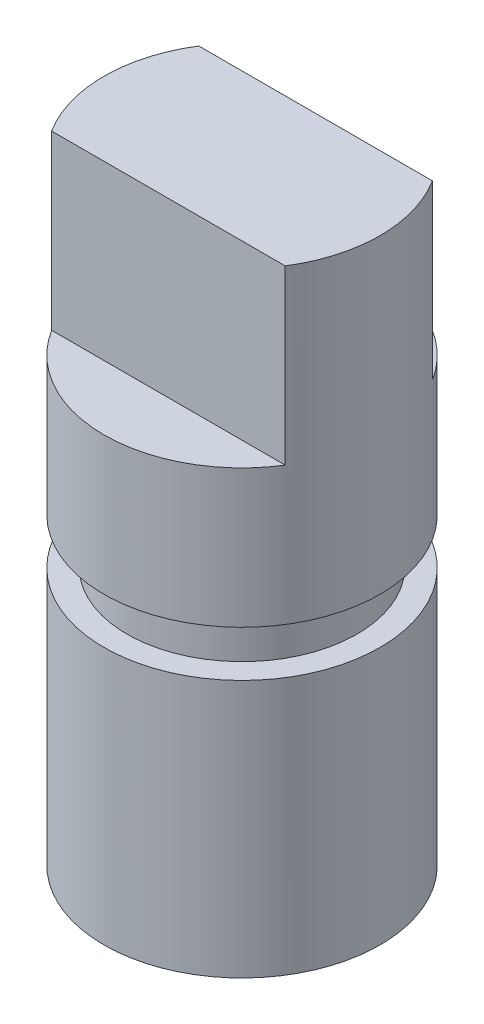
ISO-10303-21;
HEADER;
FILE_DESCRIPTION(('STEP AP214'),'2;1');
FILE_NAME('part.step','',(''),(''),'','','');
FILE_SCHEMA(('AUTOMOTIVE_DESIGN { 1 0 10303 214 1 1 1 1 }'));
ENDSEC;
DATA;
#1=APPLICATION_CONTEXT('core data for automotive mechanical design processes');
#2=APPLICATION_PROTOCOL_DEFINITION('international standard','automotive_design',2000,#1);
#3=PRODUCT_CONTEXT('',#1,'mechanical');
#4=PRODUCT('Part','Part','',(#3));
#5=PRODUCT_RELATED_PRODUCT_CATEGORY('part','',(#4));
#6=PRODUCT_DEFINITION_FORMATION('','',#4);
#7=PRODUCT_DEFINITION_CONTEXT('part definition',#1,'design');
#8=PRODUCT_DEFINITION('design','',#6,#7);
#9=PRODUCT_DEFINITION_SHAPE('','',#8);
#10=(LENGTH_UNIT() NAMED_UNIT(*) SI_UNIT(.MILLI.,.METRE.));
#11=(NAMED_UNIT(*) PLANE_ANGLE_UNIT() SI_UNIT($,.RADIAN.));
#12=(NAMED_UNIT(*) SI_UNIT($,.STERADIAN.) SOLID_ANGLE_UNIT());
#13=UNCERTAINTY_MEASURE_WITH_UNIT(LENGTH_MEASURE(1.E-05),#10,'distance_accuracy_value','');
#14=(GEOMETRIC_REPRESENTATION_CONTEXT(3) GLOBAL_UNCERTAINTY_ASSIGNED_CONTEXT((#13)) GLOBAL_UNIT_ASSIGNED_CONTEXT((#10,
#11,#12)) REPRESENTATION_CONTEXT('',''));
#15=CARTESIAN_POINT('',(0.,0.,0.));
#16=DIRECTION('',(0.,0.,1.));
#17=DIRECTION('',(1.,0.,0.));
#18=AXIS2_PLACEMENT_3D('',#15,#16,#17);
#19=CARTESIAN_POINT('',(0.,9.6,0.));
#20=DIRECTION('',(0.,-1.,0.));
#21=DIRECTION('',(0.,0.,-1.));
#22=AXIS2_PLACEMENT_3D('',#19,#20,#21);
#23=CYLINDRICAL_SURFACE('',#22,3.);
#24=CARTESIAN_POINT('',(0.,0.,0.));
#25=DIRECTION('',(0.,1.,0.));
#26=DIRECTION('',(0.,0.,1.));
#27=AXIS2_PLACEMENT_3D('',#24,#25,#26);
#28=CIRCLE('',#27,3.);
#29=CARTESIAN_POINT('',(0.,0.,3.));
#30=VERTEX_POINT('',#29);
#31=EDGE_CURVE('E41',#30,#30,#28,.T.);
#32=ORIENTED_EDGE('',*,*,#31,.T.);
#33=EDGE_LOOP('',(#32));
#34=FACE_BOUND('',#33,.T.);
#35=CARTESIAN_POINT('',(0.,5.6,0.));
#36=DIRECTION('',(0.,-1.,0.));
#37=DIRECTION('',(0.,0.,-1.));
#38=AXIS2_PLACEMENT_3D('',#35,#36,#37);
#39=CIRCLE('',#38,3.);
#40=CARTESIAN_POINT('',(0.,5.6,-3.));
#41=VERTEX_POINT('',#40);
#42=EDGE_CURVE('E178',#41,#41,#39,.T.);
#43=ORIENTED_EDGE('',*,*,#42,.T.);
#44=EDGE_LOOP('',(#43));
#45=FACE_BOUND('',#44,.T.);
#46=ADVANCED_FACE('F38',(#34,#45),#23,.T.);
#47=CARTESIAN_POINT('',(0.,0.,0.));
#48=DIRECTION('',(0.,1.,0.));
#49=DIRECTION('',(0.,0.,1.));
#50=AXIS2_PLACEMENT_3D('',#47,#48,#49);
#51=PLANE('',#50);
#52=CARTESIAN_POINT('',(0.,0.,0.));
#53=DIRECTION('',(0.,-1.,0.));
#54=DIRECTION('',(0.,0.,-1.));
#55=AXIS2_PLACEMENT_3D('',#52,#53,#54);
#56=CIRCLE('',#55,1.75);
#57=CARTESIAN_POINT('',(0.,0.,-1.75));
#58=VERTEX_POINT('',#57);
#59=EDGE_CURVE('E104',#58,#58,#56,.T.);
#60=ORIENTED_EDGE('',*,*,#59,.F.);
#61=EDGE_LOOP('',(#60));
#62=FACE_BOUND('',#61,.T.);
#63=ORIENTED_EDGE('',*,*,#31,.F.);
#64=EDGE_LOOP('',(#63));
#65=FACE_BOUND('',#64,.T.);
#66=ADVANCED_FACE('F124',(#62,#65),#51,.F.);
#67=CARTESIAN_POINT('',(0.,1.,0.));
#68=DIRECTION('',(0.,-1.,0.));
#69=DIRECTION('',(0.,0.,-1.));
#70=AXIS2_PLACEMENT_3D('',#67,#68,#69);
#71=CYLINDRICAL_SURFACE('',#70,1.75);
#72=CARTESIAN_POINT('',(0.,1.,0.));
#73=DIRECTION('',(0.,-1.,0.));
#74=DIRECTION('',(0.,0.,-1.));
#75=AXIS2_PLACEMENT_3D('',#72,#73,#74);
#76=CIRCLE('',#75,1.75);
#77=CARTESIAN_POINT('',(0.,1.,-1.75));
#78=VERTEX_POINT('',#77);
#79=EDGE_CURVE('E109',#78,#78,#76,.T.);
#80=ORIENTED_EDGE('',*,*,#79,.F.);
#81=EDGE_LOOP('',(#80));
#82=FACE_BOUND('',#81,.T.);
#83=ORIENTED_EDGE('',*,*,#59,.T.);
#84=EDGE_LOOP('',(#83));
#85=FACE_BOUND('',#84,.T.);
#86=ADVANCED_FACE('F126',(#82,#85),#71,.F.);
#87=CARTESIAN_POINT('',(0.,1.,0.));
#88=DIRECTION('',(0.,-1.,0.));
#89=DIRECTION('',(0.,0.,-1.));
#90=AXIS2_PLACEMENT_3D('',#87,#88,#89);
#91=PLANE('',#90);
#92=ORIENTED_EDGE('',*,*,#79,.T.);
#93=EDGE_LOOP('',(#92));
#94=FACE_BOUND('',#93,.T.);
#95=ADVANCED_FACE('F132',(#94),#91,.T.);
#96=CARTESIAN_POINT('',(0.,5.6,3.));
#97=DIRECTION('',(0.,1.,0.));
#98=DIRECTION('',(0.,0.,1.));
#99=AXIS2_PLACEMENT_3D('',#96,#97,#98);
#100=PLANE('',#99);
#101=CARTESIAN_POINT('',(0.,5.6,0.));
#102=DIRECTION('',(0.,-1.,0.));
#103=DIRECTION('',(0.,0.,-1.));
#104=AXIS2_PLACEMENT_3D('',#101,#102,#103);
#105=CIRCLE('',#104,2.5);
#106=CARTESIAN_POINT('',(0.,5.6,-2.5));
#107=VERTEX_POINT('',#106);
#108=EDGE_CURVE('E173',#107,#107,#105,.T.);
#109=ORIENTED_EDGE('',*,*,#108,.T.);
#110=EDGE_LOOP('',(#109));
#111=FACE_BOUND('',#110,.T.);
#112=ORIENTED_EDGE('',*,*,#42,.F.);
#113=EDGE_LOOP('',(#112));
#114=FACE_BOUND('',#113,.T.);
#115=ADVANCED_FACE('F144',(#111,#114),#100,.T.);
#116=CARTESIAN_POINT('',(0.,0.,0.));
#117=DIRECTION('',(0.,-1.,0.));
#118=DIRECTION('',(0.,0.,-1.));
#119=AXIS2_PLACEMENT_3D('',#116,#117,#118);
#120=CYLINDRICAL_SURFACE('',#119,2.5);
#121=CARTESIAN_POINT('',(0.,6.6,0.));
#122=DIRECTION('',(0.,-1.,0.));
#123=DIRECTION('',(0.,0.,-1.));
#124=AXIS2_PLACEMENT_3D('',#121,#122,#123);
#125=CIRCLE('',#124,2.5);
#126=CARTESIAN_POINT('',(0.,6.6,-2.5));
#127=VERTEX_POINT('',#126);
#128=EDGE_CURVE('E171',#127,#127,#125,.T.);
#129=ORIENTED_EDGE('',*,*,#128,.T.);
#130=EDGE_LOOP('',(#129));
#131=FACE_BOUND('',#130,.T.);
#132=ORIENTED_EDGE('',*,*,#108,.F.);
#133=EDGE_LOOP('',(#132));
#134=FACE_BOUND('',#133,.T.);
#135=ADVANCED_FACE('F156',(#131,#134),#120,.T.);
#136=CARTESIAN_POINT('',(0.,6.6,3.));
#137=DIRECTION('',(0.,-1.,0.));
#138=DIRECTION('',(0.,0.,-1.));
#139=AXIS2_PLACEMENT_3D('',#136,#137,#138);
#140=PLANE('',#139);
#141=CARTESIAN_POINT('',(0.,6.6,0.));
#142=DIRECTION('',(0.,-1.,0.));
#143=DIRECTION('',(0.,0.,-1.));
#144=AXIS2_PLACEMENT_3D('',#141,#142,#143);
#145=CIRCLE('',#144,3.);
#146=CARTESIAN_POINT('',(0.,6.6,-3.));
#147=VERTEX_POINT('',#146);
#148=EDGE_CURVE('E168',#147,#147,#145,.T.);
#149=ORIENTED_EDGE('',*,*,#148,.T.);
#150=EDGE_LOOP('',(#149));
#151=FACE_BOUND('',#150,.T.);
#152=ORIENTED_EDGE('',*,*,#128,.F.);
#153=EDGE_LOOP('',(#152));
#154=FACE_BOUND('',#153,.T.);
#155=ADVANCED_FACE('F139',(#151,#154),#140,.T.);
#156=CARTESIAN_POINT('',(0.,9.6,0.));
#157=DIRECTION('',(0.,1.,0.));
#158=DIRECTION('',(0.,0.,1.));
#159=AXIS2_PLACEMENT_3D('',#156,#157,#158);
#160=PLANE('',#159);
#161=DIRECTION('',(1.,0.,0.));
#162=VECTOR('',#161,1.);
#163=CARTESIAN_POINT('',(-2.5377155080899,9.6,1.6));
#164=LINE('',#163,#162);
#165=CARTESIAN_POINT('',(-2.53771550808991,9.6,1.6));
#166=VERTEX_POINT('',#165);
#167=CARTESIAN_POINT('',(2.5377155080899,9.6,1.6));
#168=VERTEX_POINT('',#167);
#169=EDGE_CURVE('E53',#166,#168,#164,.T.);
#170=ORIENTED_EDGE('',*,*,#169,.F.);
#171=CARTESIAN_POINT('',(0.,9.6,0.));
#172=DIRECTION('',(0.,1.,0.));
#173=DIRECTION('',(0.,0.,1.));
#174=AXIS2_PLACEMENT_3D('',#171,#172,#173);
#175=CIRCLE('',#174,3.);
#176=EDGE_CURVE('E47',#166,#168,#175,.T.);
#177=ORIENTED_EDGE('',*,*,#176,.T.);
#178=EDGE_LOOP('',(#170,#177));
#179=FACE_BOUND('',#178,.T.);
#180=ADVANCED_FACE('F138',(#179),#160,.T.);
#181=CARTESIAN_POINT('',(-2.5377155080899,13.35,1.6));
#182=DIRECTION('',(0.,0.,-1.));
#183=DIRECTION('',(-1.,0.,0.));
#184=AXIS2_PLACEMENT_3D('',#181,#182,#183);
#185=PLANE('',#184);
#186=ORIENTED_EDGE('',*,*,#169,.T.);
#187=DIRECTION('',(0.,-1.,0.));
#188=VECTOR('',#187,1.);
#189=CARTESIAN_POINT('',(2.5377155080899,13.35,1.6));
#190=LINE('',#189,#188);
#191=CARTESIAN_POINT('',(2.5377155080899,13.35,1.6));
#192=VERTEX_POINT('',#191);
#193=EDGE_CURVE('E84',#192,#168,#190,.T.);
#194=ORIENTED_EDGE('',*,*,#193,.F.);
#195=DIRECTION('',(1.,0.,0.));
#196=VECTOR('',#195,1.);
#197=CARTESIAN_POINT('',(-2.5377155080899,13.35,1.6));
#198=LINE('',#197,#196);
#199=CARTESIAN_POINT('',(-2.5377155080899,13.35,1.6));
#200=VERTEX_POINT('',#199);
#201=EDGE_CURVE('E78',#200,#192,#198,.T.);
#202=ORIENTED_EDGE('',*,*,#201,.F.);
#203=DIRECTION('',(0.,-1.,0.));
#204=VECTOR('',#203,1.);
#205=CARTESIAN_POINT('',(-2.5377155080899,13.35,1.6));
#206=LINE('',#205,#204);
#207=EDGE_CURVE('E82',#200,#166,#206,.T.);
#208=ORIENTED_EDGE('',*,*,#207,.T.);
#209=EDGE_LOOP('',(#186,#194,#202,#208));
#210=FACE_BOUND('',#209,.T.);
#211=ADVANCED_FACE('F80',(#210),#185,.F.);
#212=CARTESIAN_POINT('',(0.,13.35,0.));
#213=DIRECTION('',(0.,1.,0.));
#214=DIRECTION('',(0.,0.,1.));
#215=AXIS2_PLACEMENT_3D('',#212,#213,#214);
#216=PLANE('',#215);
#217=CARTESIAN_POINT('',(0.,13.35,0.));
#218=DIRECTION('',(0.,1.,0.));
#219=DIRECTION('',(0.,0.,1.));
#220=AXIS2_PLACEMENT_3D('',#217,#218,#219);
#221=CIRCLE('',#220,3.);
#222=CARTESIAN_POINT('',(-2.5377155080899,13.35,-1.6));
#223=VERTEX_POINT('',#222);
#224=EDGE_CURVE('E89',#223,#200,#221,.T.);
#225=ORIENTED_EDGE('',*,*,#224,.T.);
#226=ORIENTED_EDGE('',*,*,#201,.T.);
#227=CARTESIAN_POINT('',(0.,13.35,0.));
#228=DIRECTION('',(0.,1.,0.));
#229=DIRECTION('',(0.,0.,1.));
#230=AXIS2_PLACEMENT_3D('',#227,#228,#229);
#231=CIRCLE('',#230,3.);
#232=CARTESIAN_POINT('',(2.5377155080899,13.35,-1.6));
#233=VERTEX_POINT('',#232);
#234=EDGE_CURVE('E88',#192,#233,#231,.T.);
#235=ORIENTED_EDGE('',*,*,#234,.T.);
#236=DIRECTION('',(-1.,0.,0.));
#237=VECTOR('',#236,1.);
#238=CARTESIAN_POINT('',(-2.5377155080899,13.35,-1.6));
#239=LINE('',#238,#237);
#240=EDGE_CURVE('E94',#233,#223,#239,.T.);
#241=ORIENTED_EDGE('',*,*,#240,.T.);
#242=EDGE_LOOP('',(#225,#226,#235,#241));
#243=FACE_BOUND('',#242,.T.);
#244=ADVANCED_FACE('F92',(#243),#216,.T.);
#245=CARTESIAN_POINT('',(-2.5377155080899,13.35,-1.6));
#246=DIRECTION('',(0.,0.,1.));
#247=DIRECTION('',(1.,0.,0.));
#248=AXIS2_PLACEMENT_3D('',#245,#246,#247);
#249=PLANE('',#248);
#250=DIRECTION('',(-1.,0.,0.));
#251=VECTOR('',#250,1.);
#252=CARTESIAN_POINT('',(-2.5377155080899,9.6,-1.6));
#253=LINE('',#252,#251);
#254=CARTESIAN_POINT('',(2.53771550808991,9.6,-1.6));
#255=VERTEX_POINT('',#254);
#256=CARTESIAN_POINT('',(-2.53771550808991,9.6,-1.6));
#257=VERTEX_POINT('',#256);
#258=EDGE_CURVE('E99',#255,#257,#253,.T.);
#259=ORIENTED_EDGE('',*,*,#258,.T.);
#260=DIRECTION('',(0.,-1.,0.));
#261=VECTOR('',#260,1.);
#262=CARTESIAN_POINT('',(-2.5377155080899,13.35,-1.6));
#263=LINE('',#262,#261);
#264=EDGE_CURVE('E189',#223,#257,#263,.T.);
#265=ORIENTED_EDGE('',*,*,#264,.F.);
#266=ORIENTED_EDGE('',*,*,#240,.F.);
#267=DIRECTION('',(0.,-1.,0.));
#268=VECTOR('',#267,1.);
#269=CARTESIAN_POINT('',(2.5377155080899,13.35,-1.6));
#270=LINE('',#269,#268);
#271=EDGE_CURVE('E111',#233,#255,#270,.T.);
#272=ORIENTED_EDGE('',*,*,#271,.T.);
#273=EDGE_LOOP('',(#259,#265,#266,#272));
#274=FACE_BOUND('',#273,.T.);
#275=ADVANCED_FACE('F148',(#274),#249,.F.);
#276=ORIENTED_EDGE('',*,*,#258,.F.);
#277=EDGE_CURVE('E11',#255,#257,#175,.T.);
#278=ORIENTED_EDGE('',*,*,#277,.T.);
#279=EDGE_LOOP('',(#276,#278));
#280=FACE_BOUND('',#279,.T.);
#281=ADVANCED_FACE('F140',(#280),#160,.T.);
#282=ORIENTED_EDGE('',*,*,#277,.F.);
#283=ORIENTED_EDGE('',*,*,#271,.F.);
#284=ORIENTED_EDGE('',*,*,#234,.F.);
#285=ORIENTED_EDGE('',*,*,#193,.T.);
#286=ORIENTED_EDGE('',*,*,#176,.F.);
#287=ORIENTED_EDGE('',*,*,#207,.F.);
#288=ORIENTED_EDGE('',*,*,#224,.F.);
#289=ORIENTED_EDGE('',*,*,#264,.T.);
#290=EDGE_LOOP('',(#282,#283,#284,#285,#286,#287,#288,#289));
#291=FACE_BOUND('',#290,.T.);
#292=ORIENTED_EDGE('',*,*,#148,.F.);
#293=EDGE_LOOP('',(#292));
#294=FACE_BOUND('',#293,.T.);
#295=ADVANCED_FACE('F101',(#291,#294),#23,.T.);
#296=CLOSED_SHELL('',(#46,#66,#86,#95,#115,#135,#155,#180,#211,#244,#275,#281,#295));
#297=MANIFOLD_SOLID_BREP('B2',#296);
#298=ADVANCED_BREP_SHAPE_REPRESENTATION('',(#18,#297),#14);
#299=SHAPE_DEFINITION_REPRESENTATION(#9,#298);
ENDSEC;
END-ISO-10303-21;
